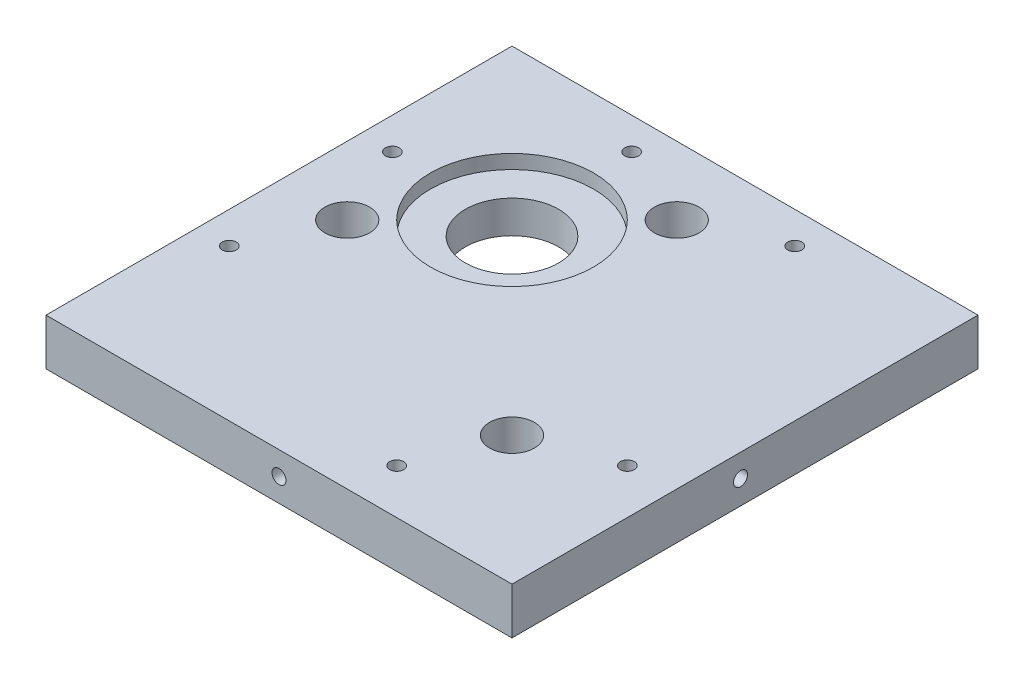
ISO-10303-21;
HEADER;
FILE_DESCRIPTION(('STEP AP214'),'2;1');
FILE_NAME('part.step','',(''),(''),'','','');
FILE_SCHEMA(('AUTOMOTIVE_DESIGN { 1 0 10303 214 1 1 1 1 }'));
ENDSEC;
DATA;
#1=APPLICATION_CONTEXT('core data for automotive mechanical design processes');
#2=APPLICATION_PROTOCOL_DEFINITION('international standard','automotive_design',2000,#1);
#3=PRODUCT_CONTEXT('',#1,'mechanical');
#4=PRODUCT('Part','Part','',(#3));
#5=PRODUCT_RELATED_PRODUCT_CATEGORY('part','',(#4));
#6=PRODUCT_DEFINITION_FORMATION('','',#4);
#7=PRODUCT_DEFINITION_CONTEXT('part definition',#1,'design');
#8=PRODUCT_DEFINITION('design','',#6,#7);
#9=PRODUCT_DEFINITION_SHAPE('','',#8);
#10=(LENGTH_UNIT() NAMED_UNIT(*) SI_UNIT(.MILLI.,.METRE.));
#11=(NAMED_UNIT(*) PLANE_ANGLE_UNIT() SI_UNIT($,.RADIAN.));
#12=(NAMED_UNIT(*) SI_UNIT($,.STERADIAN.) SOLID_ANGLE_UNIT());
#13=UNCERTAINTY_MEASURE_WITH_UNIT(LENGTH_MEASURE(1.E-05),#10,'distance_accuracy_value','');
#14=(GEOMETRIC_REPRESENTATION_CONTEXT(3) GLOBAL_UNCERTAINTY_ASSIGNED_CONTEXT((#13)) GLOBAL_UNIT_ASSIGNED_CONTEXT((#10,
#11,#12)) REPRESENTATION_CONTEXT('',''));
#15=CARTESIAN_POINT('',(0.,0.,0.));
#16=DIRECTION('',(0.,0.,1.));
#17=DIRECTION('',(1.,0.,0.));
#18=AXIS2_PLACEMENT_3D('',#15,#16,#17);
#19=CARTESIAN_POINT('',(50.,10.,-50.));
#20=DIRECTION('',(-1.,0.,0.));
#21=DIRECTION('',(0.,0.,1.));
#22=AXIS2_PLACEMENT_3D('',#19,#20,#21);
#23=PLANE('',#22);
#24=CARTESIAN_POINT('',(50.,5.09633099189297,0.963309918929706));
#25=DIRECTION('',(1.,0.,0.));
#26=DIRECTION('',(0.,0.,-1.));
#27=AXIS2_PLACEMENT_3D('',#24,#25,#26);
#28=CIRCLE('',#27,1.5);
#29=CARTESIAN_POINT('',(50.,5.09633099189297,-0.536690081070295));
#30=VERTEX_POINT('',#29);
#31=EDGE_CURVE('E176',#30,#30,#28,.T.);
#32=ORIENTED_EDGE('',*,*,#31,.F.);
#33=EDGE_LOOP('',(#32));
#34=FACE_BOUND('',#33,.T.);
#35=DIRECTION('',(0.,0.,-1.));
#36=VECTOR('',#35,1.);
#37=CARTESIAN_POINT('',(50.,0.,-50.));
#38=LINE('',#37,#36);
#39=CARTESIAN_POINT('',(50.,0.,50.));
#40=VERTEX_POINT('',#39);
#41=CARTESIAN_POINT('',(50.,0.,-50.));
#42=VERTEX_POINT('',#41);
#43=EDGE_CURVE('E115',#40,#42,#38,.T.);
#44=ORIENTED_EDGE('',*,*,#43,.T.);
#45=DIRECTION('',(0.,-1.,0.));
#46=VECTOR('',#45,1.);
#47=CARTESIAN_POINT('',(50.,10.,-50.));
#48=LINE('',#47,#46);
#49=CARTESIAN_POINT('',(50.,10.,-50.));
#50=VERTEX_POINT('',#49);
#51=EDGE_CURVE('E13',#50,#42,#48,.T.);
#52=ORIENTED_EDGE('',*,*,#51,.F.);
#53=DIRECTION('',(0.,0.,-1.));
#54=VECTOR('',#53,1.);
#55=CARTESIAN_POINT('',(50.,10.,-50.));
#56=LINE('',#55,#54);
#57=CARTESIAN_POINT('',(50.,10.,50.));
#58=VERTEX_POINT('',#57);
#59=EDGE_CURVE('E102',#58,#50,#56,.T.);
#60=ORIENTED_EDGE('',*,*,#59,.F.);
#61=DIRECTION('',(0.,-1.,0.));
#62=VECTOR('',#61,1.);
#63=CARTESIAN_POINT('',(50.,10.,50.));
#64=LINE('',#63,#62);
#65=EDGE_CURVE('E111',#58,#40,#64,.T.);
#66=ORIENTED_EDGE('',*,*,#65,.T.);
#67=EDGE_LOOP('',(#44,#52,#60,#66));
#68=FACE_BOUND('',#67,.T.);
#69=ADVANCED_FACE('F49',(#34,#68),#23,.F.);
#70=CARTESIAN_POINT('',(-50.,10.,-50.));
#71=DIRECTION('',(0.,0.,1.));
#72=DIRECTION('',(1.,0.,0.));
#73=AXIS2_PLACEMENT_3D('',#70,#71,#72);
#74=PLANE('',#73);
#75=CARTESIAN_POINT('',(0.,5.,-50.));
#76=DIRECTION('',(0.,0.,-1.));
#77=DIRECTION('',(-1.,0.,0.));
#78=AXIS2_PLACEMENT_3D('',#75,#76,#77);
#79=CIRCLE('',#78,1.5);
#80=CARTESIAN_POINT('',(-1.50000000000001,5.,-50.));
#81=VERTEX_POINT('',#80);
#82=EDGE_CURVE('E187',#81,#81,#79,.T.);
#83=ORIENTED_EDGE('',*,*,#82,.F.);
#84=EDGE_LOOP('',(#83));
#85=FACE_BOUND('',#84,.T.);
#86=DIRECTION('',(-1.,0.,0.));
#87=VECTOR('',#86,1.);
#88=CARTESIAN_POINT('',(-50.,0.,-50.));
#89=LINE('',#88,#87);
#90=CARTESIAN_POINT('',(-50.,0.,-50.));
#91=VERTEX_POINT('',#90);
#92=EDGE_CURVE('E106',#42,#91,#89,.T.);
#93=ORIENTED_EDGE('',*,*,#92,.T.);
#94=DIRECTION('',(0.,-1.,0.));
#95=VECTOR('',#94,1.);
#96=CARTESIAN_POINT('',(-50.,10.,-50.));
#97=LINE('',#96,#95);
#98=CARTESIAN_POINT('',(-50.,10.,-50.));
#99=VERTEX_POINT('',#98);
#100=EDGE_CURVE('E58',#99,#91,#97,.T.);
#101=ORIENTED_EDGE('',*,*,#100,.F.);
#102=DIRECTION('',(-1.,0.,0.));
#103=VECTOR('',#102,1.);
#104=CARTESIAN_POINT('',(-50.,10.,-50.));
#105=LINE('',#104,#103);
#106=EDGE_CURVE('E97',#50,#99,#105,.T.);
#107=ORIENTED_EDGE('',*,*,#106,.F.);
#108=ORIENTED_EDGE('',*,*,#51,.T.);
#109=EDGE_LOOP('',(#93,#101,#107,#108));
#110=FACE_BOUND('',#109,.T.);
#111=ADVANCED_FACE('F105',(#85,#110),#74,.F.);
#112=CARTESIAN_POINT('',(-50.,10.,-50.));
#113=DIRECTION('',(1.,0.,0.));
#114=DIRECTION('',(0.,0.,-1.));
#115=AXIS2_PLACEMENT_3D('',#112,#113,#114);
#116=PLANE('',#115);
#117=CARTESIAN_POINT('',(-50.,5.,0.));
#118=DIRECTION('',(-1.,0.,0.));
#119=DIRECTION('',(0.,0.,1.));
#120=AXIS2_PLACEMENT_3D('',#117,#118,#119);
#121=CIRCLE('',#120,1.5);
#122=CARTESIAN_POINT('',(-50.,5.,1.50000000000001));
#123=VERTEX_POINT('',#122);
#124=EDGE_CURVE('E354',#123,#123,#121,.T.);
#125=ORIENTED_EDGE('',*,*,#124,.F.);
#126=EDGE_LOOP('',(#125));
#127=FACE_BOUND('',#126,.T.);
#128=DIRECTION('',(0.,0.,1.));
#129=VECTOR('',#128,1.);
#130=CARTESIAN_POINT('',(-50.,0.,-50.));
#131=LINE('',#130,#129);
#132=CARTESIAN_POINT('',(-50.,0.,50.));
#133=VERTEX_POINT('',#132);
#134=EDGE_CURVE('E84',#91,#133,#131,.T.);
#135=ORIENTED_EDGE('',*,*,#134,.T.);
#136=DIRECTION('',(0.,-1.,0.));
#137=VECTOR('',#136,1.);
#138=CARTESIAN_POINT('',(-50.,10.,50.));
#139=LINE('',#138,#137);
#140=CARTESIAN_POINT('',(-50.,10.,50.));
#141=VERTEX_POINT('',#140);
#142=EDGE_CURVE('E107',#141,#133,#139,.T.);
#143=ORIENTED_EDGE('',*,*,#142,.F.);
#144=DIRECTION('',(0.,0.,1.));
#145=VECTOR('',#144,1.);
#146=CARTESIAN_POINT('',(-50.,10.,-50.));
#147=LINE('',#146,#145);
#148=EDGE_CURVE('E100',#99,#141,#147,.T.);
#149=ORIENTED_EDGE('',*,*,#148,.F.);
#150=ORIENTED_EDGE('',*,*,#100,.T.);
#151=EDGE_LOOP('',(#135,#143,#149,#150));
#152=FACE_BOUND('',#151,.T.);
#153=ADVANCED_FACE('F109',(#127,#152),#116,.F.);
#154=CARTESIAN_POINT('',(-50.,10.,50.));
#155=DIRECTION('',(0.,0.,-1.));
#156=DIRECTION('',(-1.,0.,0.));
#157=AXIS2_PLACEMENT_3D('',#154,#155,#156);
#158=PLANE('',#157);
#159=CARTESIAN_POINT('',(0.,5.,50.));
#160=DIRECTION('',(0.,0.,1.));
#161=DIRECTION('',(1.,0.,0.));
#162=AXIS2_PLACEMENT_3D('',#159,#160,#161);
#163=CIRCLE('',#162,1.5);
#164=CARTESIAN_POINT('',(1.50000000000002,5.,50.));
#165=VERTEX_POINT('',#164);
#166=EDGE_CURVE('E355',#165,#165,#163,.T.);
#167=ORIENTED_EDGE('',*,*,#166,.F.);
#168=EDGE_LOOP('',(#167));
#169=FACE_BOUND('',#168,.T.);
#170=DIRECTION('',(1.,0.,0.));
#171=VECTOR('',#170,1.);
#172=CARTESIAN_POINT('',(-50.,0.,50.));
#173=LINE('',#172,#171);
#174=EDGE_CURVE('E90',#133,#40,#173,.T.);
#175=ORIENTED_EDGE('',*,*,#174,.T.);
#176=ORIENTED_EDGE('',*,*,#65,.F.);
#177=DIRECTION('',(1.,0.,0.));
#178=VECTOR('',#177,1.);
#179=CARTESIAN_POINT('',(-50.,10.,50.));
#180=LINE('',#179,#178);
#181=EDGE_CURVE('E67',#141,#58,#180,.T.);
#182=ORIENTED_EDGE('',*,*,#181,.F.);
#183=ORIENTED_EDGE('',*,*,#142,.T.);
#184=EDGE_LOOP('',(#175,#176,#182,#183));
#185=FACE_BOUND('',#184,.T.);
#186=ADVANCED_FACE('F153',(#169,#185),#158,.F.);
#187=CARTESIAN_POINT('',(0.,10.,0.));
#188=DIRECTION('',(0.,1.,0.));
#189=DIRECTION('',(0.,0.,1.));
#190=AXIS2_PLACEMENT_3D('',#187,#188,#189);
#191=PLANE('',#190);
#192=CARTESIAN_POINT('',(15.6048160490641,10.,40.3535533905933));
#193=DIRECTION('',(0.,1.,0.));
#194=DIRECTION('',(0.,0.,-1.));
#195=AXIS2_PLACEMENT_3D('',#192,#193,#194);
#196=CIRCLE('',#195,1.5);
#197=CARTESIAN_POINT('',(15.6048160490641,10.,38.8535533905933));
#198=VERTEX_POINT('',#197);
#199=EDGE_CURVE('E184',#198,#198,#196,.T.);
#200=ORIENTED_EDGE('',*,*,#199,.F.);
#201=EDGE_LOOP('',(#200));
#202=FACE_BOUND('',#201,.T.);
#203=CARTESIAN_POINT('',(40.3535533905933,10.,15.6048160490641));
#204=DIRECTION('',(0.,1.,0.));
#205=DIRECTION('',(0.,0.,1.));
#206=AXIS2_PLACEMENT_3D('',#203,#204,#205);
#207=CIRCLE('',#206,1.5);
#208=CARTESIAN_POINT('',(40.3535533905933,10.,17.1048160490641));
#209=VERTEX_POINT('',#208);
#210=EDGE_CURVE('E194',#209,#209,#207,.T.);
#211=ORIENTED_EDGE('',*,*,#210,.F.);
#212=EDGE_LOOP('',(#211));
#213=FACE_BOUND('',#212,.T.);
#214=CARTESIAN_POINT('',(22.3223304703363,10.,22.3223304703363));
#215=DIRECTION('',(0.,1.,0.));
#216=DIRECTION('',(0.,0.,1.));
#217=AXIS2_PLACEMENT_3D('',#214,#215,#216);
#218=CIRCLE('',#217,4.8);
#219=CARTESIAN_POINT('',(22.3223304703363,10.,27.1223304703363));
#220=VERTEX_POINT('',#219);
#221=EDGE_CURVE('E200',#220,#220,#218,.T.);
#222=ORIENTED_EDGE('',*,*,#221,.F.);
#223=EDGE_LOOP('',(#222));
#224=FACE_BOUND('',#223,.T.);
#225=CARTESIAN_POINT('',(-43.1798592389054,10.,17.5));
#226=DIRECTION('',(0.,1.,0.));
#227=DIRECTION('',(0.,0.,-1.));
#228=AXIS2_PLACEMENT_3D('',#225,#226,#227);
#229=CIRCLE('',#228,1.50000000000001);
#230=CARTESIAN_POINT('',(-43.1798592389054,10.,16.));
#231=VERTEX_POINT('',#230);
#232=EDGE_CURVE('E213',#231,#231,#229,.T.);
#233=ORIENTED_EDGE('',*,*,#232,.F.);
#234=EDGE_LOOP('',(#233));
#235=FACE_BOUND('',#234,.T.);
#236=CARTESIAN_POINT('',(17.5,10.,-43.1798592389054));
#237=DIRECTION('',(0.,1.,0.));
#238=DIRECTION('',(0.,0.,1.));
#239=AXIS2_PLACEMENT_3D('',#236,#237,#238);
#240=CIRCLE('',#239,1.50000000000005);
#241=CARTESIAN_POINT('',(17.5,10.,-41.6798592389053));
#242=VERTEX_POINT('',#241);
#243=EDGE_CURVE('E219',#242,#242,#240,.T.);
#244=ORIENTED_EDGE('',*,*,#243,.F.);
#245=EDGE_LOOP('',(#244));
#246=FACE_BOUND('',#245,.T.);
#247=CARTESIAN_POINT('',(-17.5,10.,-43.1798592389054));
#248=DIRECTION('',(0.,1.,0.));
#249=DIRECTION('',(0.,0.,-1.));
#250=AXIS2_PLACEMENT_3D('',#247,#248,#249);
#251=CIRCLE('',#250,1.50000000000002);
#252=CARTESIAN_POINT('',(-17.5,10.,-44.6798592389054));
#253=VERTEX_POINT('',#252);
#254=EDGE_CURVE('E206',#253,#253,#251,.T.);
#255=ORIENTED_EDGE('',*,*,#254,.F.);
#256=EDGE_LOOP('',(#255));
#257=FACE_BOUND('',#256,.T.);
#258=CARTESIAN_POINT('',(-43.1798592389054,10.,-17.5));
#259=DIRECTION('',(0.,1.,0.));
#260=DIRECTION('',(0.,0.,1.));
#261=AXIS2_PLACEMENT_3D('',#258,#259,#260);
#262=CIRCLE('',#261,1.5);
#263=CARTESIAN_POINT('',(-43.1798592389054,10.,-16.));
#264=VERTEX_POINT('',#263);
#265=EDGE_CURVE('E212',#264,#264,#262,.T.);
#266=ORIENTED_EDGE('',*,*,#265,.F.);
#267=EDGE_LOOP('',(#266));
#268=FACE_BOUND('',#267,.T.);
#269=CARTESIAN_POINT('',(0.,10.,-35.3553390593274));
#270=DIRECTION('',(0.,1.,0.));
#271=DIRECTION('',(0.,0.,-1.));
#272=AXIS2_PLACEMENT_3D('',#269,#270,#271);
#273=CIRCLE('',#272,4.79999999999998);
#274=CARTESIAN_POINT('',(0.,10.,-40.1553390593273));
#275=VERTEX_POINT('',#274);
#276=EDGE_CURVE('E137',#275,#275,#273,.T.);
#277=ORIENTED_EDGE('',*,*,#276,.F.);
#278=EDGE_LOOP('',(#277));
#279=FACE_BOUND('',#278,.T.);
#280=CARTESIAN_POINT('',(-35.3553390593274,10.,0.));
#281=DIRECTION('',(0.,1.,0.));
#282=DIRECTION('',(0.,0.,1.));
#283=AXIS2_PLACEMENT_3D('',#280,#281,#282);
#284=CIRCLE('',#283,4.8);
#285=CARTESIAN_POINT('',(-35.3553390593274,10.,4.8));
#286=VERTEX_POINT('',#285);
#287=EDGE_CURVE('E126',#286,#286,#284,.T.);
#288=ORIENTED_EDGE('',*,*,#287,.F.);
#289=EDGE_LOOP('',(#288));
#290=FACE_BOUND('',#289,.T.);
#291=CARTESIAN_POINT('',(-17.6776695296637,10.,-17.6776695296637));
#292=DIRECTION('',(0.,1.,0.));
#293=DIRECTION('',(0.,0.,1.));
#294=AXIS2_PLACEMENT_3D('',#291,#292,#293);
#295=CIRCLE('',#294,17.5);
#296=CARTESIAN_POINT('',(-17.6776695296637,10.,-0.177669529663683));
#297=VERTEX_POINT('',#296);
#298=EDGE_CURVE('E142',#297,#297,#295,.T.);
#299=ORIENTED_EDGE('',*,*,#298,.F.);
#300=EDGE_LOOP('',(#299));
#301=FACE_BOUND('',#300,.T.);
#302=ORIENTED_EDGE('',*,*,#59,.T.);
#303=ORIENTED_EDGE('',*,*,#106,.T.);
#304=ORIENTED_EDGE('',*,*,#148,.T.);
#305=ORIENTED_EDGE('',*,*,#181,.T.);
#306=EDGE_LOOP('',(#302,#303,#304,#305));
#307=FACE_BOUND('',#306,.T.);
#308=ADVANCED_FACE('F98',(#202,#213,#224,#235,#246,#257,#268,#279,#290,#301,#307),#191,.T.);
#309=CARTESIAN_POINT('',(0.,0.,0.));
#310=DIRECTION('',(0.,1.,0.));
#311=DIRECTION('',(0.,0.,1.));
#312=AXIS2_PLACEMENT_3D('',#309,#310,#311);
#313=PLANE('',#312);
#314=CARTESIAN_POINT('',(22.3223304703363,0.,22.3223304703363));
#315=DIRECTION('',(0.,1.,0.));
#316=DIRECTION('',(0.,0.,1.));
#317=AXIS2_PLACEMENT_3D('',#314,#315,#316);
#318=CIRCLE('',#317,4.8);
#319=CARTESIAN_POINT('',(22.3223304703363,0.,27.1223304703363));
#320=VERTEX_POINT('',#319);
#321=EDGE_CURVE('E203',#320,#320,#318,.T.);
#322=ORIENTED_EDGE('',*,*,#321,.T.);
#323=EDGE_LOOP('',(#322));
#324=FACE_BOUND('',#323,.T.);
#325=CARTESIAN_POINT('',(0.,0.,-35.3553390593274));
#326=DIRECTION('',(0.,1.,0.));
#327=DIRECTION('',(0.,0.,1.));
#328=AXIS2_PLACEMENT_3D('',#325,#326,#327);
#329=CIRCLE('',#328,4.79999999999998);
#330=CARTESIAN_POINT('',(0.,0.,-30.5553390593274));
#331=VERTEX_POINT('',#330);
#332=EDGE_CURVE('E52',#331,#331,#329,.T.);
#333=ORIENTED_EDGE('',*,*,#332,.T.);
#334=EDGE_LOOP('',(#333));
#335=FACE_BOUND('',#334,.T.);
#336=CARTESIAN_POINT('',(-35.3553390593274,0.,0.));
#337=DIRECTION('',(0.,1.,0.));
#338=DIRECTION('',(0.,0.,1.));
#339=AXIS2_PLACEMENT_3D('',#336,#337,#338);
#340=CIRCLE('',#339,4.8);
#341=CARTESIAN_POINT('',(-35.3553390593274,0.,4.8));
#342=VERTEX_POINT('',#341);
#343=EDGE_CURVE('E123',#342,#342,#340,.T.);
#344=ORIENTED_EDGE('',*,*,#343,.T.);
#345=EDGE_LOOP('',(#344));
#346=FACE_BOUND('',#345,.T.);
#347=CARTESIAN_POINT('',(-17.6776695296637,0.,-17.6776695296637));
#348=DIRECTION('',(0.,1.,0.));
#349=DIRECTION('',(0.,0.,1.));
#350=AXIS2_PLACEMENT_3D('',#347,#348,#349);
#351=CIRCLE('',#350,10.);
#352=CARTESIAN_POINT('',(-17.6776695296637,0.,-7.67766952966368));
#353=VERTEX_POINT('',#352);
#354=EDGE_CURVE('E130',#353,#353,#351,.T.);
#355=ORIENTED_EDGE('',*,*,#354,.T.);
#356=EDGE_LOOP('',(#355));
#357=FACE_BOUND('',#356,.T.);
#358=ORIENTED_EDGE('',*,*,#43,.F.);
#359=ORIENTED_EDGE('',*,*,#174,.F.);
#360=ORIENTED_EDGE('',*,*,#134,.F.);
#361=ORIENTED_EDGE('',*,*,#92,.F.);
#362=EDGE_LOOP('',(#358,#359,#360,#361));
#363=FACE_BOUND('',#362,.T.);
#364=ADVANCED_FACE('F152',(#324,#335,#346,#357,#363),#313,.F.);
#365=CARTESIAN_POINT('',(-17.6776695296637,7.,-17.6776695296637));
#366=DIRECTION('',(0.,1.,0.));
#367=DIRECTION('',(0.,0.,1.));
#368=AXIS2_PLACEMENT_3D('',#365,#366,#367);
#369=CYLINDRICAL_SURFACE('',#368,17.5);
#370=CARTESIAN_POINT('',(-17.6776695296637,7.,-17.6776695296637));
#371=DIRECTION('',(0.,1.,0.));
#372=DIRECTION('',(0.,0.,1.));
#373=AXIS2_PLACEMENT_3D('',#370,#371,#372);
#374=CIRCLE('',#373,17.5);
#375=CARTESIAN_POINT('',(-17.6776695296637,7.,-0.177669529663683));
#376=VERTEX_POINT('',#375);
#377=EDGE_CURVE('E118',#376,#376,#374,.T.);
#378=ORIENTED_EDGE('',*,*,#377,.F.);
#379=EDGE_LOOP('',(#378));
#380=FACE_BOUND('',#379,.T.);
#381=ORIENTED_EDGE('',*,*,#298,.T.);
#382=EDGE_LOOP('',(#381));
#383=FACE_BOUND('',#382,.T.);
#384=ADVANCED_FACE('F149',(#380,#383),#369,.F.);
#385=CARTESIAN_POINT('',(-17.6776695296637,7.,-17.6776695296637));
#386=DIRECTION('',(0.,1.,0.));
#387=DIRECTION('',(0.,0.,1.));
#388=AXIS2_PLACEMENT_3D('',#385,#386,#387);
#389=PLANE('',#388);
#390=CARTESIAN_POINT('',(-17.6776695296637,7.,-17.6776695296637));
#391=DIRECTION('',(0.,1.,0.));
#392=DIRECTION('',(0.,0.,1.));
#393=AXIS2_PLACEMENT_3D('',#390,#391,#392);
#394=CIRCLE('',#393,10.);
#395=CARTESIAN_POINT('',(-17.6776695296637,7.,-7.67766952966368));
#396=VERTEX_POINT('',#395);
#397=EDGE_CURVE('E125',#396,#396,#394,.T.);
#398=ORIENTED_EDGE('',*,*,#397,.F.);
#399=EDGE_LOOP('',(#398));
#400=FACE_BOUND('',#399,.T.);
#401=ORIENTED_EDGE('',*,*,#377,.T.);
#402=EDGE_LOOP('',(#401));
#403=FACE_BOUND('',#402,.T.);
#404=ADVANCED_FACE('F252',(#400,#403),#389,.T.);
#405=CARTESIAN_POINT('',(-17.6776695296637,0.,-17.6776695296637));
#406=DIRECTION('',(0.,1.,0.));
#407=DIRECTION('',(0.,0.,1.));
#408=AXIS2_PLACEMENT_3D('',#405,#406,#407);
#409=CYLINDRICAL_SURFACE('',#408,10.);
#410=ORIENTED_EDGE('',*,*,#354,.F.);
#411=EDGE_LOOP('',(#410));
#412=FACE_BOUND('',#411,.T.);
#413=ORIENTED_EDGE('',*,*,#397,.T.);
#414=EDGE_LOOP('',(#413));
#415=FACE_BOUND('',#414,.T.);
#416=ADVANCED_FACE('F249',(#412,#415),#409,.F.);
#417=CARTESIAN_POINT('',(-35.3553390593274,-10.,0.));
#418=DIRECTION('',(0.,1.,0.));
#419=DIRECTION('',(0.,0.,1.));
#420=AXIS2_PLACEMENT_3D('',#417,#418,#419);
#421=CYLINDRICAL_SURFACE('',#420,4.8);
#422=ORIENTED_EDGE('',*,*,#287,.T.);
#423=EDGE_LOOP('',(#422));
#424=FACE_BOUND('',#423,.T.);
#425=ORIENTED_EDGE('',*,*,#343,.F.);
#426=EDGE_LOOP('',(#425));
#427=FACE_BOUND('',#426,.T.);
#428=ADVANCED_FACE('F242',(#424,#427),#421,.F.);
#429=CARTESIAN_POINT('',(0.,-10.,-35.3553390593274));
#430=DIRECTION('',(0.,1.,0.));
#431=DIRECTION('',(0.,0.,1.));
#432=AXIS2_PLACEMENT_3D('',#429,#430,#431);
#433=CYLINDRICAL_SURFACE('',#432,4.79999999999998);
#434=ORIENTED_EDGE('',*,*,#276,.T.);
#435=EDGE_LOOP('',(#434));
#436=FACE_BOUND('',#435,.T.);
#437=ORIENTED_EDGE('',*,*,#332,.F.);
#438=EDGE_LOOP('',(#437));
#439=FACE_BOUND('',#438,.T.);
#440=ADVANCED_FACE('F239',(#436,#439),#433,.F.);
#441=CARTESIAN_POINT('',(-43.1798592389054,5.,-17.5));
#442=DIRECTION('',(0.,1.,0.));
#443=DIRECTION('',(0.,0.,1.));
#444=AXIS2_PLACEMENT_3D('',#441,#442,#443);
#445=CYLINDRICAL_SURFACE('',#444,1.5);
#446=CARTESIAN_POINT('',(-43.1798592389054,5.,-17.5));
#447=DIRECTION('',(0.,1.,0.));
#448=DIRECTION('',(0.,0.,1.));
#449=AXIS2_PLACEMENT_3D('',#446,#447,#448);
#450=CIRCLE('',#449,1.5);
#451=CARTESIAN_POINT('',(-43.1798592389054,5.,-16.));
#452=VERTEX_POINT('',#451);
#453=EDGE_CURVE('E227',#452,#452,#450,.T.);
#454=ORIENTED_EDGE('',*,*,#453,.F.);
#455=EDGE_LOOP('',(#454));
#456=FACE_BOUND('',#455,.T.);
#457=ORIENTED_EDGE('',*,*,#265,.T.);
#458=EDGE_LOOP('',(#457));
#459=FACE_BOUND('',#458,.T.);
#460=ADVANCED_FACE('F232',(#456,#459),#445,.F.);
#461=CARTESIAN_POINT('',(-43.1798592389054,5.,-17.5));
#462=DIRECTION('',(0.,1.,0.));
#463=DIRECTION('',(0.,0.,1.));
#464=AXIS2_PLACEMENT_3D('',#461,#462,#463);
#465=PLANE('',#464);
#466=ORIENTED_EDGE('',*,*,#453,.T.);
#467=EDGE_LOOP('',(#466));
#468=FACE_BOUND('',#467,.T.);
#469=ADVANCED_FACE('F269',(#468),#465,.T.);
#470=CARTESIAN_POINT('',(-17.5,5.,-43.1798592389054));
#471=DIRECTION('',(0.,1.,0.));
#472=DIRECTION('',(0.,0.,1.));
#473=AXIS2_PLACEMENT_3D('',#470,#471,#472);
#474=CYLINDRICAL_SURFACE('',#473,1.50000000000002);
#475=CARTESIAN_POINT('',(-17.5,5.,-43.1798592389054));
#476=DIRECTION('',(0.,1.,0.));
#477=DIRECTION('',(0.,0.,-1.));
#478=AXIS2_PLACEMENT_3D('',#475,#476,#477);
#479=CIRCLE('',#478,1.50000000000002);
#480=CARTESIAN_POINT('',(-17.5,5.,-44.6798592389054));
#481=VERTEX_POINT('',#480);
#482=EDGE_CURVE('E222',#481,#481,#479,.T.);
#483=ORIENTED_EDGE('',*,*,#482,.F.);
#484=EDGE_LOOP('',(#483));
#485=FACE_BOUND('',#484,.T.);
#486=ORIENTED_EDGE('',*,*,#254,.T.);
#487=EDGE_LOOP('',(#486));
#488=FACE_BOUND('',#487,.T.);
#489=ADVANCED_FACE('F273',(#485,#488),#474,.F.);
#490=CARTESIAN_POINT('',(-17.5,5.,-43.1798592389054));
#491=DIRECTION('',(0.,-1.,0.));
#492=DIRECTION('',(0.,0.,-1.));
#493=AXIS2_PLACEMENT_3D('',#490,#491,#492);
#494=PLANE('',#493);
#495=ORIENTED_EDGE('',*,*,#482,.T.);
#496=EDGE_LOOP('',(#495));
#497=FACE_BOUND('',#496,.T.);
#498=ADVANCED_FACE('F277',(#497),#494,.F.);
#499=CARTESIAN_POINT('',(17.5,5.,-43.1798592389054));
#500=DIRECTION('',(0.,1.,0.));
#501=DIRECTION('',(0.,0.,1.));
#502=AXIS2_PLACEMENT_3D('',#499,#500,#501);
#503=CYLINDRICAL_SURFACE('',#502,1.50000000000005);
#504=CARTESIAN_POINT('',(17.5,5.,-43.1798592389054));
#505=DIRECTION('',(0.,1.,0.));
#506=DIRECTION('',(0.,0.,1.));
#507=AXIS2_PLACEMENT_3D('',#504,#505,#506);
#508=CIRCLE('',#507,1.50000000000005);
#509=CARTESIAN_POINT('',(17.5,5.,-41.6798592389053));
#510=VERTEX_POINT('',#509);
#511=EDGE_CURVE('E216',#510,#510,#508,.T.);
#512=ORIENTED_EDGE('',*,*,#511,.F.);
#513=EDGE_LOOP('',(#512));
#514=FACE_BOUND('',#513,.T.);
#515=ORIENTED_EDGE('',*,*,#243,.T.);
#516=EDGE_LOOP('',(#515));
#517=FACE_BOUND('',#516,.T.);
#518=ADVANCED_FACE('F281',(#514,#517),#503,.F.);
#519=CARTESIAN_POINT('',(17.5,5.,-43.1798592389054));
#520=DIRECTION('',(0.,1.,0.));
#521=DIRECTION('',(0.,0.,1.));
#522=AXIS2_PLACEMENT_3D('',#519,#520,#521);
#523=PLANE('',#522);
#524=ORIENTED_EDGE('',*,*,#511,.T.);
#525=EDGE_LOOP('',(#524));
#526=FACE_BOUND('',#525,.T.);
#527=ADVANCED_FACE('F285',(#526),#523,.T.);
#528=CARTESIAN_POINT('',(-43.1798592389054,5.,17.5));
#529=DIRECTION('',(0.,1.,0.));
#530=DIRECTION('',(0.,0.,1.));
#531=AXIS2_PLACEMENT_3D('',#528,#529,#530);
#532=CYLINDRICAL_SURFACE('',#531,1.50000000000001);
#533=CARTESIAN_POINT('',(-43.1798592389054,5.,17.5));
#534=DIRECTION('',(0.,1.,0.));
#535=DIRECTION('',(0.,0.,-1.));
#536=AXIS2_PLACEMENT_3D('',#533,#534,#535);
#537=CIRCLE('',#536,1.50000000000001);
#538=CARTESIAN_POINT('',(-43.1798592389054,5.,16.));
#539=VERTEX_POINT('',#538);
#540=EDGE_CURVE('E209',#539,#539,#537,.T.);
#541=ORIENTED_EDGE('',*,*,#540,.F.);
#542=EDGE_LOOP('',(#541));
#543=FACE_BOUND('',#542,.T.);
#544=ORIENTED_EDGE('',*,*,#232,.T.);
#545=EDGE_LOOP('',(#544));
#546=FACE_BOUND('',#545,.T.);
#547=ADVANCED_FACE('F289',(#543,#546),#532,.F.);
#548=CARTESIAN_POINT('',(-43.1798592389054,5.,17.5));
#549=DIRECTION('',(0.,-1.,0.));
#550=DIRECTION('',(0.,0.,-1.));
#551=AXIS2_PLACEMENT_3D('',#548,#549,#550);
#552=PLANE('',#551);
#553=ORIENTED_EDGE('',*,*,#540,.T.);
#554=EDGE_LOOP('',(#553));
#555=FACE_BOUND('',#554,.T.);
#556=ADVANCED_FACE('F293',(#555),#552,.F.);
#557=CARTESIAN_POINT('',(22.3223304703363,0.,22.3223304703363));
#558=DIRECTION('',(0.,1.,0.));
#559=DIRECTION('',(0.,0.,1.));
#560=AXIS2_PLACEMENT_3D('',#557,#558,#559);
#561=CYLINDRICAL_SURFACE('',#560,4.8);
#562=ORIENTED_EDGE('',*,*,#321,.F.);
#563=EDGE_LOOP('',(#562));
#564=FACE_BOUND('',#563,.T.);
#565=ORIENTED_EDGE('',*,*,#221,.T.);
#566=EDGE_LOOP('',(#565));
#567=FACE_BOUND('',#566,.T.);
#568=ADVANCED_FACE('F297',(#564,#567),#561,.F.);
#569=CARTESIAN_POINT('',(40.3535533905933,5.,15.6048160490641));
#570=DIRECTION('',(0.,1.,0.));
#571=DIRECTION('',(0.,0.,1.));
#572=AXIS2_PLACEMENT_3D('',#569,#570,#571);
#573=CYLINDRICAL_SURFACE('',#572,1.5);
#574=CARTESIAN_POINT('',(40.3535533905933,5.,15.6048160490641));
#575=DIRECTION('',(0.,1.,0.));
#576=DIRECTION('',(0.,0.,1.));
#577=AXIS2_PLACEMENT_3D('',#574,#575,#576);
#578=CIRCLE('',#577,1.5);
#579=CARTESIAN_POINT('',(40.3535533905933,5.,17.1048160490641));
#580=VERTEX_POINT('',#579);
#581=EDGE_CURVE('E197',#580,#580,#578,.T.);
#582=ORIENTED_EDGE('',*,*,#581,.F.);
#583=EDGE_LOOP('',(#582));
#584=FACE_BOUND('',#583,.T.);
#585=ORIENTED_EDGE('',*,*,#210,.T.);
#586=EDGE_LOOP('',(#585));
#587=FACE_BOUND('',#586,.T.);
#588=ADVANCED_FACE('F301',(#584,#587),#573,.F.);
#589=CARTESIAN_POINT('',(40.3535533905933,5.,15.6048160490641));
#590=DIRECTION('',(0.,1.,0.));
#591=DIRECTION('',(0.,0.,1.));
#592=AXIS2_PLACEMENT_3D('',#589,#590,#591);
#593=PLANE('',#592);
#594=ORIENTED_EDGE('',*,*,#581,.T.);
#595=EDGE_LOOP('',(#594));
#596=FACE_BOUND('',#595,.T.);
#597=ADVANCED_FACE('F305',(#596),#593,.T.);
#598=CARTESIAN_POINT('',(15.6048160490641,5.,40.3535533905933));
#599=DIRECTION('',(0.,1.,0.));
#600=DIRECTION('',(0.,0.,1.));
#601=AXIS2_PLACEMENT_3D('',#598,#599,#600);
#602=CYLINDRICAL_SURFACE('',#601,1.5);
#603=CARTESIAN_POINT('',(15.6048160490641,5.,40.3535533905933));
#604=DIRECTION('',(0.,1.,0.));
#605=DIRECTION('',(0.,0.,-1.));
#606=AXIS2_PLACEMENT_3D('',#603,#604,#605);
#607=CIRCLE('',#606,1.5);
#608=CARTESIAN_POINT('',(15.6048160490641,5.,38.8535533905933));
#609=VERTEX_POINT('',#608);
#610=EDGE_CURVE('E191',#609,#609,#607,.T.);
#611=ORIENTED_EDGE('',*,*,#610,.F.);
#612=EDGE_LOOP('',(#611));
#613=FACE_BOUND('',#612,.T.);
#614=ORIENTED_EDGE('',*,*,#199,.T.);
#615=EDGE_LOOP('',(#614));
#616=FACE_BOUND('',#615,.T.);
#617=ADVANCED_FACE('F309',(#613,#616),#602,.F.);
#618=CARTESIAN_POINT('',(15.6048160490641,5.,40.3535533905933));
#619=DIRECTION('',(0.,-1.,0.));
#620=DIRECTION('',(0.,0.,-1.));
#621=AXIS2_PLACEMENT_3D('',#618,#619,#620);
#622=PLANE('',#621);
#623=ORIENTED_EDGE('',*,*,#610,.T.);
#624=EDGE_LOOP('',(#623));
#625=FACE_BOUND('',#624,.T.);
#626=ADVANCED_FACE('F313',(#625),#622,.F.);
#627=CARTESIAN_POINT('',(45.,5.09633099189297,0.963309918929706));
#628=DIRECTION('',(1.,0.,0.));
#629=DIRECTION('',(0.,0.,-1.));
#630=AXIS2_PLACEMENT_3D('',#627,#628,#629);
#631=CYLINDRICAL_SURFACE('',#630,1.5);
#632=CARTESIAN_POINT('',(45.,5.09633099189297,0.963309918929706));
#633=DIRECTION('',(1.,0.,0.));
#634=DIRECTION('',(0.,0.,-1.));
#635=AXIS2_PLACEMENT_3D('',#632,#633,#634);
#636=CIRCLE('',#635,1.5);
#637=CARTESIAN_POINT('',(45.,5.09633099189297,-0.536690081070294));
#638=VERTEX_POINT('',#637);
#639=EDGE_CURVE('E180',#638,#638,#636,.T.);
#640=ORIENTED_EDGE('',*,*,#639,.F.);
#641=EDGE_LOOP('',(#640));
#642=FACE_BOUND('',#641,.T.);
#643=ORIENTED_EDGE('',*,*,#31,.T.);
#644=EDGE_LOOP('',(#643));
#645=FACE_BOUND('',#644,.T.);
#646=ADVANCED_FACE('F317',(#642,#645),#631,.F.);
#647=CARTESIAN_POINT('',(45.,5.09633099189297,0.963309918929706));
#648=DIRECTION('',(1.,0.,0.));
#649=DIRECTION('',(0.,0.,-1.));
#650=AXIS2_PLACEMENT_3D('',#647,#648,#649);
#651=PLANE('',#650);
#652=ORIENTED_EDGE('',*,*,#639,.T.);
#653=EDGE_LOOP('',(#652));
#654=FACE_BOUND('',#653,.T.);
#655=ADVANCED_FACE('F321',(#654),#651,.T.);
#656=CARTESIAN_POINT('',(0.,5.,-45.));
#657=DIRECTION('',(0.,0.,-1.));
#658=DIRECTION('',(-1.,0.,0.));
#659=AXIS2_PLACEMENT_3D('',#656,#657,#658);
#660=CYLINDRICAL_SURFACE('',#659,1.5);
#661=CARTESIAN_POINT('',(0.,5.,-45.));
#662=DIRECTION('',(0.,0.,-1.));
#663=DIRECTION('',(-1.,0.,0.));
#664=AXIS2_PLACEMENT_3D('',#661,#662,#663);
#665=CIRCLE('',#664,1.5);
#666=CARTESIAN_POINT('',(-1.50000000000001,5.,-45.));
#667=VERTEX_POINT('',#666);
#668=EDGE_CURVE('E181',#667,#667,#665,.T.);
#669=ORIENTED_EDGE('',*,*,#668,.F.);
#670=EDGE_LOOP('',(#669));
#671=FACE_BOUND('',#670,.T.);
#672=ORIENTED_EDGE('',*,*,#82,.T.);
#673=EDGE_LOOP('',(#672));
#674=FACE_BOUND('',#673,.T.);
#675=ADVANCED_FACE('F325',(#671,#674),#660,.F.);
#676=CARTESIAN_POINT('',(0.,5.,-45.));
#677=DIRECTION('',(0.,0.,-1.));
#678=DIRECTION('',(-1.,0.,0.));
#679=AXIS2_PLACEMENT_3D('',#676,#677,#678);
#680=PLANE('',#679);
#681=ORIENTED_EDGE('',*,*,#668,.T.);
#682=EDGE_LOOP('',(#681));
#683=FACE_BOUND('',#682,.T.);
#684=ADVANCED_FACE('F329',(#683),#680,.T.);
#685=CARTESIAN_POINT('',(-45.,5.,0.));
#686=DIRECTION('',(-1.,0.,0.));
#687=DIRECTION('',(0.,0.,1.));
#688=AXIS2_PLACEMENT_3D('',#685,#686,#687);
#689=CYLINDRICAL_SURFACE('',#688,1.5);
#690=CARTESIAN_POINT('',(-45.,5.,0.));
#691=DIRECTION('',(-1.,0.,0.));
#692=DIRECTION('',(0.,0.,1.));
#693=AXIS2_PLACEMENT_3D('',#690,#691,#692);
#694=CIRCLE('',#693,1.5);
#695=CARTESIAN_POINT('',(-45.,5.,1.50000000000001));
#696=VERTEX_POINT('',#695);
#697=EDGE_CURVE('E358',#696,#696,#694,.T.);
#698=ORIENTED_EDGE('',*,*,#697,.F.);
#699=EDGE_LOOP('',(#698));
#700=FACE_BOUND('',#699,.T.);
#701=ORIENTED_EDGE('',*,*,#124,.T.);
#702=EDGE_LOOP('',(#701));
#703=FACE_BOUND('',#702,.T.);
#704=ADVANCED_FACE('F333',(#700,#703),#689,.F.);
#705=CARTESIAN_POINT('',(-45.,5.,0.));
#706=DIRECTION('',(-1.,0.,0.));
#707=DIRECTION('',(0.,0.,1.));
#708=AXIS2_PLACEMENT_3D('',#705,#706,#707);
#709=PLANE('',#708);
#710=ORIENTED_EDGE('',*,*,#697,.T.);
#711=EDGE_LOOP('',(#710));
#712=FACE_BOUND('',#711,.T.);
#713=ADVANCED_FACE('F337',(#712),#709,.T.);
#714=CARTESIAN_POINT('',(0.,5.,45.));
#715=DIRECTION('',(0.,0.,1.));
#716=DIRECTION('',(1.,0.,0.));
#717=AXIS2_PLACEMENT_3D('',#714,#715,#716);
#718=CYLINDRICAL_SURFACE('',#717,1.5);
#719=CARTESIAN_POINT('',(0.,5.,45.));
#720=DIRECTION('',(0.,0.,1.));
#721=DIRECTION('',(1.,0.,0.));
#722=AXIS2_PLACEMENT_3D('',#719,#720,#721);
#723=CIRCLE('',#722,1.5);
#724=CARTESIAN_POINT('',(1.50000000000002,5.,45.));
#725=VERTEX_POINT('',#724);
#726=EDGE_CURVE('E353',#725,#725,#723,.T.);
#727=ORIENTED_EDGE('',*,*,#726,.F.);
#728=EDGE_LOOP('',(#727));
#729=FACE_BOUND('',#728,.T.);
#730=ORIENTED_EDGE('',*,*,#166,.T.);
#731=EDGE_LOOP('',(#730));
#732=FACE_BOUND('',#731,.T.);
#733=ADVANCED_FACE('F341',(#729,#732),#718,.F.);
#734=CARTESIAN_POINT('',(0.,5.,45.));
#735=DIRECTION('',(0.,0.,1.));
#736=DIRECTION('',(1.,0.,0.));
#737=AXIS2_PLACEMENT_3D('',#734,#735,#736);
#738=PLANE('',#737);
#739=ORIENTED_EDGE('',*,*,#726,.T.);
#740=EDGE_LOOP('',(#739));
#741=FACE_BOUND('',#740,.T.);
#742=ADVANCED_FACE('F345',(#741),#738,.T.);
#743=CLOSED_SHELL('',(#69,#111,#153,#186,#308,#364,#384,#404,#416,#428,#440,#460,#469,#489,#498,
#518,#527,#547,#556,#568,#588,#597,#617,#626,#646,#655,#675,#684,#704,#713,#733,#742));
#744=MANIFOLD_SOLID_BREP('B2',#743);
#745=ADVANCED_BREP_SHAPE_REPRESENTATION('',(#18,#744),#14);
#746=SHAPE_DEFINITION_REPRESENTATION(#9,#745);
ENDSEC;
END-ISO-10303-21;
